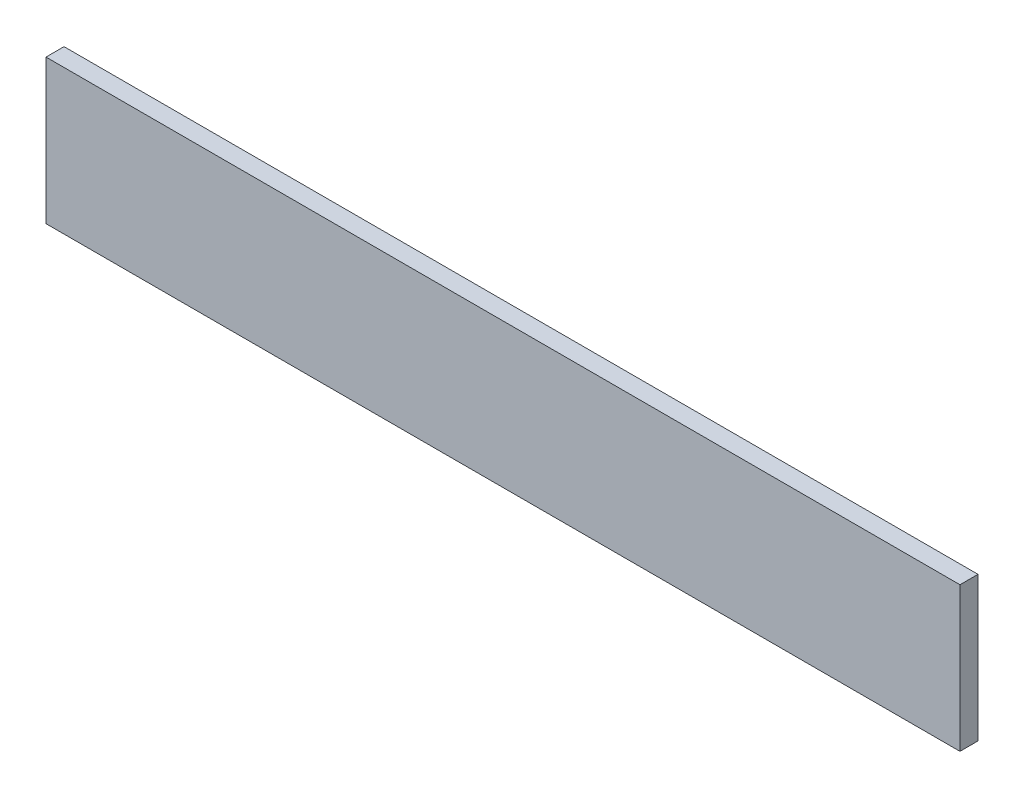
ISO-10303-21;
HEADER;
FILE_DESCRIPTION(('STEP AP214'),'2;1');
FILE_NAME('part.step','',(''),(''),'','','');
FILE_SCHEMA(('AUTOMOTIVE_DESIGN { 1 0 10303 214 1 1 1 1 }'));
ENDSEC;
DATA;
#1=APPLICATION_CONTEXT('core data for automotive mechanical design processes');
#2=APPLICATION_PROTOCOL_DEFINITION('international standard','automotive_design',2000,#1);
#3=PRODUCT_CONTEXT('',#1,'mechanical');
#4=PRODUCT('Part','Part','',(#3));
#5=PRODUCT_RELATED_PRODUCT_CATEGORY('part','',(#4));
#6=PRODUCT_DEFINITION_FORMATION('','',#4);
#7=PRODUCT_DEFINITION_CONTEXT('part definition',#1,'design');
#8=PRODUCT_DEFINITION('design','',#6,#7);
#9=PRODUCT_DEFINITION_SHAPE('','',#8);
#10=(LENGTH_UNIT() NAMED_UNIT(*) SI_UNIT(.MILLI.,.METRE.));
#11=(NAMED_UNIT(*) PLANE_ANGLE_UNIT() SI_UNIT($,.RADIAN.));
#12=(NAMED_UNIT(*) SI_UNIT($,.STERADIAN.) SOLID_ANGLE_UNIT());
#13=UNCERTAINTY_MEASURE_WITH_UNIT(LENGTH_MEASURE(1.E-05),#10,'distance_accuracy_value','');
#14=(GEOMETRIC_REPRESENTATION_CONTEXT(3) GLOBAL_UNCERTAINTY_ASSIGNED_CONTEXT((#13)) GLOBAL_UNIT_ASSIGNED_CONTEXT((#10,
#11,#12)) REPRESENTATION_CONTEXT('',''));
#15=CARTESIAN_POINT('',(0.,0.,0.));
#16=DIRECTION('',(0.,0.,1.));
#17=DIRECTION('',(1.,0.,0.));
#18=AXIS2_PLACEMENT_3D('',#15,#16,#17);
#19=CARTESIAN_POINT('',(120.65,-19.05,4.7625));
#20=DIRECTION('',(-1.,0.,0.));
#21=DIRECTION('',(0.,0.,1.));
#22=AXIS2_PLACEMENT_3D('',#19,#20,#21);
#23=PLANE('',#22);
#24=DIRECTION('',(0.,1.,0.));
#25=VECTOR('',#24,1.);
#26=CARTESIAN_POINT('',(120.65,-19.05,0.));
#27=LINE('',#26,#25);
#28=CARTESIAN_POINT('',(120.65,-19.05,0.));
#29=VERTEX_POINT('',#28);
#30=CARTESIAN_POINT('',(120.65,19.05,0.));
#31=VERTEX_POINT('',#30);
#32=EDGE_CURVE('E115',#29,#31,#27,.T.);
#33=ORIENTED_EDGE('',*,*,#32,.T.);
#34=DIRECTION('',(0.,0.,-1.));
#35=VECTOR('',#34,1.);
#36=CARTESIAN_POINT('',(120.65,19.05,4.7625));
#37=LINE('',#36,#35);
#38=CARTESIAN_POINT('',(120.65,19.05,4.7625));
#39=VERTEX_POINT('',#38);
#40=EDGE_CURVE('E11',#39,#31,#37,.T.);
#41=ORIENTED_EDGE('',*,*,#40,.F.);
#42=DIRECTION('',(0.,1.,0.));
#43=VECTOR('',#42,1.);
#44=CARTESIAN_POINT('',(120.65,-19.05,4.7625));
#45=LINE('',#44,#43);
#46=CARTESIAN_POINT('',(120.65,-19.05,4.7625));
#47=VERTEX_POINT('',#46);
#48=EDGE_CURVE('E97',#47,#39,#45,.T.);
#49=ORIENTED_EDGE('',*,*,#48,.F.);
#50=DIRECTION('',(0.,0.,-1.));
#51=VECTOR('',#50,1.);
#52=CARTESIAN_POINT('',(120.65,-19.05,4.7625));
#53=LINE('',#52,#51);
#54=EDGE_CURVE('E111',#47,#29,#53,.T.);
#55=ORIENTED_EDGE('',*,*,#54,.T.);
#56=EDGE_LOOP('',(#33,#41,#49,#55));
#57=FACE_BOUND('',#56,.T.);
#58=ADVANCED_FACE('F45',(#57),#23,.F.);
#59=CARTESIAN_POINT('',(-120.65,19.05,4.7625));
#60=DIRECTION('',(0.,-1.,0.));
#61=DIRECTION('',(0.,0.,-1.));
#62=AXIS2_PLACEMENT_3D('',#59,#60,#61);
#63=PLANE('',#62);
#64=DIRECTION('',(-1.,0.,0.));
#65=VECTOR('',#64,1.);
#66=CARTESIAN_POINT('',(-120.65,19.05,0.));
#67=LINE('',#66,#65);
#68=CARTESIAN_POINT('',(-120.65,19.05,0.));
#69=VERTEX_POINT('',#68);
#70=EDGE_CURVE('E102',#31,#69,#67,.T.);
#71=ORIENTED_EDGE('',*,*,#70,.T.);
#72=DIRECTION('',(0.,0.,-1.));
#73=VECTOR('',#72,1.);
#74=CARTESIAN_POINT('',(-120.65,19.05,4.7625));
#75=LINE('',#74,#73);
#76=CARTESIAN_POINT('',(-120.65,19.05,4.7625));
#77=VERTEX_POINT('',#76);
#78=EDGE_CURVE('E54',#77,#69,#75,.T.);
#79=ORIENTED_EDGE('',*,*,#78,.F.);
#80=DIRECTION('',(-1.,0.,0.));
#81=VECTOR('',#80,1.);
#82=CARTESIAN_POINT('',(-120.65,19.05,4.7625));
#83=LINE('',#82,#81);
#84=EDGE_CURVE('E92',#39,#77,#83,.T.);
#85=ORIENTED_EDGE('',*,*,#84,.F.);
#86=ORIENTED_EDGE('',*,*,#40,.T.);
#87=EDGE_LOOP('',(#71,#79,#85,#86));
#88=FACE_BOUND('',#87,.T.);
#89=ADVANCED_FACE('F101',(#88),#63,.F.);
#90=CARTESIAN_POINT('',(-120.65,-19.05,4.7625));
#91=DIRECTION('',(1.,0.,0.));
#92=DIRECTION('',(0.,0.,-1.));
#93=AXIS2_PLACEMENT_3D('',#90,#91,#92);
#94=PLANE('',#93);
#95=DIRECTION('',(0.,-1.,0.));
#96=VECTOR('',#95,1.);
#97=CARTESIAN_POINT('',(-120.65,-19.05,0.));
#98=LINE('',#97,#96);
#99=CARTESIAN_POINT('',(-120.65,-19.05,0.));
#100=VERTEX_POINT('',#99);
#101=EDGE_CURVE('E79',#69,#100,#98,.T.);
#102=ORIENTED_EDGE('',*,*,#101,.T.);
#103=DIRECTION('',(0.,0.,-1.));
#104=VECTOR('',#103,1.);
#105=CARTESIAN_POINT('',(-120.65,-19.05,4.7625));
#106=LINE('',#105,#104);
#107=CARTESIAN_POINT('',(-120.65,-19.05,4.7625));
#108=VERTEX_POINT('',#107);
#109=EDGE_CURVE('E104',#108,#100,#106,.T.);
#110=ORIENTED_EDGE('',*,*,#109,.F.);
#111=DIRECTION('',(0.,-1.,0.));
#112=VECTOR('',#111,1.);
#113=CARTESIAN_POINT('',(-120.65,-19.05,4.7625));
#114=LINE('',#113,#112);
#115=EDGE_CURVE('E95',#77,#108,#114,.T.);
#116=ORIENTED_EDGE('',*,*,#115,.F.);
#117=ORIENTED_EDGE('',*,*,#78,.T.);
#118=EDGE_LOOP('',(#102,#110,#116,#117));
#119=FACE_BOUND('',#118,.T.);
#120=ADVANCED_FACE('F105',(#119),#94,.F.);
#121=CARTESIAN_POINT('',(-120.65,-19.05,4.7625));
#122=DIRECTION('',(0.,1.,0.));
#123=DIRECTION('',(0.,0.,1.));
#124=AXIS2_PLACEMENT_3D('',#121,#122,#123);
#125=PLANE('',#124);
#126=DIRECTION('',(1.,0.,0.));
#127=VECTOR('',#126,1.);
#128=CARTESIAN_POINT('',(-120.65,-19.05,0.));
#129=LINE('',#128,#127);
#130=EDGE_CURVE('E85',#100,#29,#129,.T.);
#131=ORIENTED_EDGE('',*,*,#130,.T.);
#132=ORIENTED_EDGE('',*,*,#54,.F.);
#133=DIRECTION('',(1.,0.,0.));
#134=VECTOR('',#133,1.);
#135=CARTESIAN_POINT('',(-120.65,-19.05,4.7625));
#136=LINE('',#135,#134);
#137=EDGE_CURVE('E62',#108,#47,#136,.T.);
#138=ORIENTED_EDGE('',*,*,#137,.F.);
#139=ORIENTED_EDGE('',*,*,#109,.T.);
#140=EDGE_LOOP('',(#131,#132,#138,#139));
#141=FACE_BOUND('',#140,.T.);
#142=ADVANCED_FACE('F130',(#141),#125,.F.);
#143=CARTESIAN_POINT('',(0.,0.,4.7625));
#144=DIRECTION('',(0.,0.,-1.));
#145=DIRECTION('',(-1.,0.,0.));
#146=AXIS2_PLACEMENT_3D('',#143,#144,#145);
#147=PLANE('',#146);
#148=ORIENTED_EDGE('',*,*,#48,.T.);
#149=ORIENTED_EDGE('',*,*,#84,.T.);
#150=ORIENTED_EDGE('',*,*,#115,.T.);
#151=ORIENTED_EDGE('',*,*,#137,.T.);
#152=EDGE_LOOP('',(#148,#149,#150,#151));
#153=FACE_BOUND('',#152,.T.);
#154=ADVANCED_FACE('F93',(#153),#147,.F.);
#155=CARTESIAN_POINT('',(0.,0.,0.));
#156=DIRECTION('',(0.,0.,-1.));
#157=DIRECTION('',(-1.,0.,0.));
#158=AXIS2_PLACEMENT_3D('',#155,#156,#157);
#159=PLANE('',#158);
#160=ORIENTED_EDGE('',*,*,#32,.F.);
#161=ORIENTED_EDGE('',*,*,#130,.F.);
#162=ORIENTED_EDGE('',*,*,#101,.F.);
#163=ORIENTED_EDGE('',*,*,#70,.F.);
#164=EDGE_LOOP('',(#160,#161,#162,#163));
#165=FACE_BOUND('',#164,.T.);
#166=ADVANCED_FACE('F133',(#165),#159,.T.);
#167=CLOSED_SHELL('',(#58,#89,#120,#142,#154,#166));
#168=MANIFOLD_SOLID_BREP('B2',#167);
#169=ADVANCED_BREP_SHAPE_REPRESENTATION('',(#18,#168),#14);
#170=SHAPE_DEFINITION_REPRESENTATION(#9,#169);
ENDSEC;
END-ISO-10303-21;
